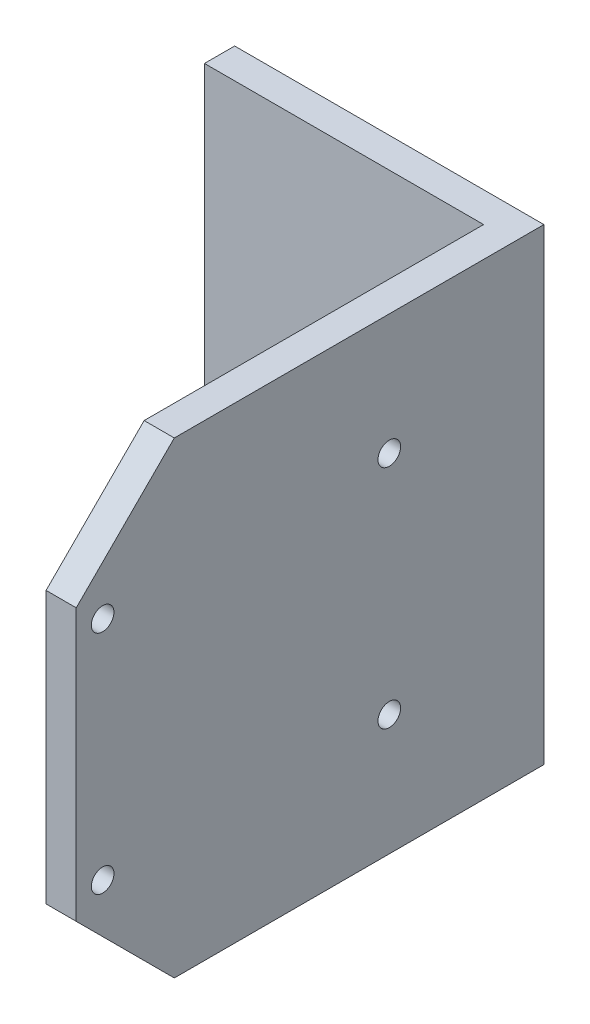
ISO-10303-21;
HEADER;
FILE_DESCRIPTION(('STEP AP214'),'2;1');
FILE_NAME('part.step','',(''),(''),'','','');
FILE_SCHEMA(('AUTOMOTIVE_DESIGN { 1 0 10303 214 1 1 1 1 }'));
ENDSEC;
DATA;
#1=APPLICATION_CONTEXT('core data for automotive mechanical design processes');
#2=APPLICATION_PROTOCOL_DEFINITION('international standard','automotive_design',2000,#1);
#3=PRODUCT_CONTEXT('',#1,'mechanical');
#4=PRODUCT('Part','Part','',(#3));
#5=PRODUCT_RELATED_PRODUCT_CATEGORY('part','',(#4));
#6=PRODUCT_DEFINITION_FORMATION('','',#4);
#7=PRODUCT_DEFINITION_CONTEXT('part definition',#1,'design');
#8=PRODUCT_DEFINITION('design','',#6,#7);
#9=PRODUCT_DEFINITION_SHAPE('','',#8);
#10=(LENGTH_UNIT() NAMED_UNIT(*) SI_UNIT(.MILLI.,.METRE.));
#11=(NAMED_UNIT(*) PLANE_ANGLE_UNIT() SI_UNIT($,.RADIAN.));
#12=(NAMED_UNIT(*) SI_UNIT($,.STERADIAN.) SOLID_ANGLE_UNIT());
#13=UNCERTAINTY_MEASURE_WITH_UNIT(LENGTH_MEASURE(1.E-05),#10,'distance_accuracy_value','');
#14=(GEOMETRIC_REPRESENTATION_CONTEXT(3) GLOBAL_UNCERTAINTY_ASSIGNED_CONTEXT((#13)) GLOBAL_UNIT_ASSIGNED_CONTEXT((#10,
#11,#12)) REPRESENTATION_CONTEXT('',''));
#15=CARTESIAN_POINT('',(0.,0.,0.));
#16=DIRECTION('',(0.,0.,1.));
#17=DIRECTION('',(1.,0.,0.));
#18=AXIS2_PLACEMENT_3D('',#15,#16,#17);
#19=CARTESIAN_POINT('',(6.87397260273973,31.,18.8424657534247));
#20=DIRECTION('',(1.,0.,0.));
#21=DIRECTION('',(0.,0.,-1.));
#22=AXIS2_PLACEMENT_3D('',#19,#20,#21);
#23=PLANE('',#22);
#24=CARTESIAN_POINT('',(6.87397260273973,15.,15.3424657534247));
#25=DIRECTION('',(1.,0.,0.));
#26=DIRECTION('',(0.,0.,-1.));
#27=AXIS2_PLACEMENT_3D('',#24,#25,#26);
#28=CIRCLE('',#27,1.5);
#29=CARTESIAN_POINT('',(6.87397260273973,15.,13.8424657534247));
#30=VERTEX_POINT('',#29);
#31=EDGE_CURVE('E176',#30,#30,#28,.T.);
#32=ORIENTED_EDGE('',*,*,#31,.T.);
#33=EDGE_LOOP('',(#32));
#34=FACE_BOUND('',#33,.T.);
#35=CARTESIAN_POINT('',(6.87397260273973,-15.,-22.6575342465753));
#36=DIRECTION('',(1.,0.,0.));
#37=DIRECTION('',(0.,0.,-1.));
#38=AXIS2_PLACEMENT_3D('',#35,#36,#37);
#39=CIRCLE('',#38,1.5);
#40=CARTESIAN_POINT('',(6.87397260273973,-15.,-24.1575342465753));
#41=VERTEX_POINT('',#40);
#42=EDGE_CURVE('E189',#41,#41,#39,.T.);
#43=ORIENTED_EDGE('',*,*,#42,.T.);
#44=EDGE_LOOP('',(#43));
#45=FACE_BOUND('',#44,.T.);
#46=DIRECTION('',(0.,-1.,0.));
#47=VECTOR('',#46,1.);
#48=CARTESIAN_POINT('',(6.87397260273973,31.,18.8424657534247));
#49=LINE('',#48,#47);
#50=CARTESIAN_POINT('',(6.87397260273973,18.,18.8424657534247));
#51=VERTEX_POINT('',#50);
#52=CARTESIAN_POINT('',(6.87397260273973,-18.,18.8424657534247));
#53=VERTEX_POINT('',#52);
#54=EDGE_CURVE('E124',#51,#53,#49,.T.);
#55=ORIENTED_EDGE('',*,*,#54,.F.);
#56=DIRECTION('',(0.,0.707106781186548,-0.707106781186548));
#57=VECTOR('',#56,1.);
#58=CARTESIAN_POINT('',(6.87397260273973,24.5,12.3424657534247));
#59=LINE('',#58,#57);
#60=CARTESIAN_POINT('',(6.87397260273973,31.,5.84246575342466));
#61=VERTEX_POINT('',#60);
#62=EDGE_CURVE('E104',#51,#61,#59,.T.);
#63=ORIENTED_EDGE('',*,*,#62,.T.);
#64=DIRECTION('',(0.,0.,1.));
#65=VECTOR('',#64,1.);
#66=CARTESIAN_POINT('',(6.87397260273973,31.,18.8424657534247));
#67=LINE('',#66,#65);
#68=CARTESIAN_POINT('',(6.87397260273973,31.,-39.1575342465753));
#69=VERTEX_POINT('',#68);
#70=EDGE_CURVE('E170',#69,#61,#67,.T.);
#71=ORIENTED_EDGE('',*,*,#70,.F.);
#72=DIRECTION('',(0.,-1.,0.));
#73=VECTOR('',#72,1.);
#74=CARTESIAN_POINT('',(6.87397260273973,31.,-39.1575342465753));
#75=LINE('',#74,#73);
#76=CARTESIAN_POINT('',(6.87397260273973,-31.,-39.1575342465753));
#77=VERTEX_POINT('',#76);
#78=EDGE_CURVE('E127',#69,#77,#75,.T.);
#79=ORIENTED_EDGE('',*,*,#78,.T.);
#80=DIRECTION('',(0.,0.,1.));
#81=VECTOR('',#80,1.);
#82=CARTESIAN_POINT('',(6.87397260273973,-31.,18.8424657534247));
#83=LINE('',#82,#81);
#84=CARTESIAN_POINT('',(6.87397260273973,-31.,5.84246575342466));
#85=VERTEX_POINT('',#84);
#86=EDGE_CURVE('E143',#77,#85,#83,.T.);
#87=ORIENTED_EDGE('',*,*,#86,.T.);
#88=DIRECTION('',(0.,-0.707106781186548,-0.707106781186548));
#89=VECTOR('',#88,1.);
#90=CARTESIAN_POINT('',(6.87397260273973,6.5,43.3424657534247));
#91=LINE('',#90,#89);
#92=EDGE_CURVE('E61',#53,#85,#91,.T.);
#93=ORIENTED_EDGE('',*,*,#92,.F.);
#94=EDGE_LOOP('',(#55,#63,#71,#79,#87,#93));
#95=FACE_BOUND('',#94,.T.);
#96=CARTESIAN_POINT('',(6.87397260273973,15.,-22.6575342465753));
#97=DIRECTION('',(1.,0.,0.));
#98=DIRECTION('',(0.,0.,-1.));
#99=AXIS2_PLACEMENT_3D('',#96,#97,#98);
#100=CIRCLE('',#99,1.5);
#101=CARTESIAN_POINT('',(6.87397260273973,15.,-24.1575342465753));
#102=VERTEX_POINT('',#101);
#103=EDGE_CURVE('E181',#102,#102,#100,.F.);
#104=ORIENTED_EDGE('',*,*,#103,.F.);
#105=EDGE_LOOP('',(#104));
#106=FACE_BOUND('',#105,.T.);
#107=CARTESIAN_POINT('',(6.87397260273973,-15.,15.3424657534247));
#108=DIRECTION('',(1.,0.,0.));
#109=DIRECTION('',(0.,0.,-1.));
#110=AXIS2_PLACEMENT_3D('',#107,#108,#109);
#111=CIRCLE('',#110,1.5);
#112=CARTESIAN_POINT('',(6.87397260273973,-15.,13.8424657534247));
#113=VERTEX_POINT('',#112);
#114=EDGE_CURVE('E173',#113,#113,#111,.F.);
#115=ORIENTED_EDGE('',*,*,#114,.F.);
#116=EDGE_LOOP('',(#115));
#117=FACE_BOUND('',#116,.T.);
#118=ADVANCED_FACE('F39',(#34,#45,#95,#106,#117),#23,.F.);
#119=CARTESIAN_POINT('',(10.8739726027397,31.,18.8424657534247));
#120=DIRECTION('',(0.,0.,-1.));
#121=DIRECTION('',(-1.,0.,0.));
#122=AXIS2_PLACEMENT_3D('',#119,#120,#121);
#123=PLANE('',#122);
#124=DIRECTION('',(0.,-1.,0.));
#125=VECTOR('',#124,1.);
#126=CARTESIAN_POINT('',(10.8739726027397,31.,18.8424657534247));
#127=LINE('',#126,#125);
#128=CARTESIAN_POINT('',(10.8739726027397,18.,18.8424657534247));
#129=VERTEX_POINT('',#128);
#130=CARTESIAN_POINT('',(10.8739726027397,-18.,18.8424657534247));
#131=VERTEX_POINT('',#130);
#132=EDGE_CURVE('E116',#129,#131,#127,.T.);
#133=ORIENTED_EDGE('',*,*,#132,.F.);
#134=DIRECTION('',(1.,0.,0.));
#135=VECTOR('',#134,1.);
#136=CARTESIAN_POINT('',(0.873972602739729,18.,18.8424657534247));
#137=LINE('',#136,#135);
#138=EDGE_CURVE('E101',#51,#129,#137,.T.);
#139=ORIENTED_EDGE('',*,*,#138,.F.);
#140=ORIENTED_EDGE('',*,*,#54,.T.);
#141=DIRECTION('',(1.,0.,0.));
#142=VECTOR('',#141,1.);
#143=CARTESIAN_POINT('',(0.873972602739729,-18.,18.8424657534247));
#144=LINE('',#143,#142);
#145=EDGE_CURVE('E123',#53,#131,#144,.T.);
#146=ORIENTED_EDGE('',*,*,#145,.T.);
#147=EDGE_LOOP('',(#133,#139,#140,#146));
#148=FACE_BOUND('',#147,.T.);
#149=ADVANCED_FACE('F122',(#148),#123,.F.);
#150=CARTESIAN_POINT('',(10.8739726027397,31.,-43.1575342465753));
#151=DIRECTION('',(-1.,0.,0.));
#152=DIRECTION('',(0.,0.,1.));
#153=AXIS2_PLACEMENT_3D('',#150,#151,#152);
#154=PLANE('',#153);
#155=CARTESIAN_POINT('',(10.8739726027397,15.,15.3424657534247));
#156=DIRECTION('',(1.,0.,0.));
#157=DIRECTION('',(0.,0.,-1.));
#158=AXIS2_PLACEMENT_3D('',#155,#156,#157);
#159=CIRCLE('',#158,1.5);
#160=CARTESIAN_POINT('',(10.8739726027397,15.,13.8424657534247));
#161=VERTEX_POINT('',#160);
#162=EDGE_CURVE('E228',#161,#161,#159,.T.);
#163=ORIENTED_EDGE('',*,*,#162,.F.);
#164=EDGE_LOOP('',(#163));
#165=FACE_BOUND('',#164,.T.);
#166=CARTESIAN_POINT('',(10.8739726027397,-15.,-22.6575342465753));
#167=DIRECTION('',(1.,0.,0.));
#168=DIRECTION('',(0.,0.,-1.));
#169=AXIS2_PLACEMENT_3D('',#166,#167,#168);
#170=CIRCLE('',#169,1.5);
#171=CARTESIAN_POINT('',(10.8739726027397,-15.,-24.1575342465753));
#172=VERTEX_POINT('',#171);
#173=EDGE_CURVE('E220',#172,#172,#170,.T.);
#174=ORIENTED_EDGE('',*,*,#173,.F.);
#175=EDGE_LOOP('',(#174));
#176=FACE_BOUND('',#175,.T.);
#177=DIRECTION('',(0.,0.,-1.));
#178=VECTOR('',#177,1.);
#179=CARTESIAN_POINT('',(10.8739726027397,31.,-43.1575342465753));
#180=LINE('',#179,#178);
#181=CARTESIAN_POINT('',(10.8739726027397,31.,5.84246575342466));
#182=VERTEX_POINT('',#181);
#183=CARTESIAN_POINT('',(10.8739726027397,31.,-43.1575342465753));
#184=VERTEX_POINT('',#183);
#185=EDGE_CURVE('E118',#182,#184,#180,.T.);
#186=ORIENTED_EDGE('',*,*,#185,.F.);
#187=DIRECTION('',(0.,0.707106781186548,-0.707106781186548));
#188=VECTOR('',#187,1.);
#189=CARTESIAN_POINT('',(10.8739726027397,18.4212328767123,18.4212328767123));
#190=LINE('',#189,#188);
#191=EDGE_CURVE('E54',#129,#182,#190,.T.);
#192=ORIENTED_EDGE('',*,*,#191,.F.);
#193=ORIENTED_EDGE('',*,*,#132,.T.);
#194=DIRECTION('',(0.,-0.707106781186548,-0.707106781186548));
#195=VECTOR('',#194,1.);
#196=CARTESIAN_POINT('',(10.8739726027397,-18.4212328767123,18.4212328767123));
#197=LINE('',#196,#195);
#198=CARTESIAN_POINT('',(10.8739726027397,-31.,5.84246575342466));
#199=VERTEX_POINT('',#198);
#200=EDGE_CURVE('E119',#131,#199,#197,.T.);
#201=ORIENTED_EDGE('',*,*,#200,.T.);
#202=DIRECTION('',(0.,0.,-1.));
#203=VECTOR('',#202,1.);
#204=CARTESIAN_POINT('',(10.8739726027397,-31.,-43.1575342465753));
#205=LINE('',#204,#203);
#206=CARTESIAN_POINT('',(10.8739726027397,-31.,-43.1575342465753));
#207=VERTEX_POINT('',#206);
#208=EDGE_CURVE('E145',#199,#207,#205,.T.);
#209=ORIENTED_EDGE('',*,*,#208,.T.);
#210=DIRECTION('',(0.,-1.,0.));
#211=VECTOR('',#210,1.);
#212=CARTESIAN_POINT('',(10.8739726027397,31.,-43.1575342465753));
#213=LINE('',#212,#211);
#214=EDGE_CURVE('E125',#184,#207,#213,.T.);
#215=ORIENTED_EDGE('',*,*,#214,.F.);
#216=EDGE_LOOP('',(#186,#192,#193,#201,#209,#215));
#217=FACE_BOUND('',#216,.T.);
#218=CARTESIAN_POINT('',(10.8739726027397,15.,-22.6575342465753));
#219=DIRECTION('',(-1.,0.,0.));
#220=DIRECTION('',(0.,0.,1.));
#221=AXIS2_PLACEMENT_3D('',#218,#219,#220);
#222=CIRCLE('',#221,1.5);
#223=CARTESIAN_POINT('',(10.8739726027397,15.,-21.1575342465753));
#224=VERTEX_POINT('',#223);
#225=EDGE_CURVE('E226',#224,#224,#222,.T.);
#226=ORIENTED_EDGE('',*,*,#225,.T.);
#227=EDGE_LOOP('',(#226));
#228=FACE_BOUND('',#227,.T.);
#229=CARTESIAN_POINT('',(10.8739726027397,-15.,15.3424657534247));
#230=DIRECTION('',(-1.,0.,0.));
#231=DIRECTION('',(0.,0.,1.));
#232=AXIS2_PLACEMENT_3D('',#229,#230,#231);
#233=CIRCLE('',#232,1.5);
#234=CARTESIAN_POINT('',(10.8739726027397,-15.,16.8424657534247));
#235=VERTEX_POINT('',#234);
#236=EDGE_CURVE('E230',#235,#235,#233,.T.);
#237=ORIENTED_EDGE('',*,*,#236,.T.);
#238=EDGE_LOOP('',(#237));
#239=FACE_BOUND('',#238,.T.);
#240=ADVANCED_FACE('F113',(#165,#176,#217,#228,#239),#154,.F.);
#241=CARTESIAN_POINT('',(0.,-31.,0.));
#242=DIRECTION('',(0.,-1.,0.));
#243=DIRECTION('',(0.,0.,-1.));
#244=AXIS2_PLACEMENT_3D('',#241,#242,#243);
#245=PLANE('',#244);
#246=ORIENTED_EDGE('',*,*,#208,.F.);
#247=DIRECTION('',(-1.,0.,0.));
#248=VECTOR('',#247,1.);
#249=CARTESIAN_POINT('',(0.,-31.,5.84246575342466));
#250=LINE('',#249,#248);
#251=EDGE_CURVE('E47',#199,#85,#250,.T.);
#252=ORIENTED_EDGE('',*,*,#251,.T.);
#253=ORIENTED_EDGE('',*,*,#86,.F.);
#254=DIRECTION('',(1.,0.,0.));
#255=VECTOR('',#254,1.);
#256=CARTESIAN_POINT('',(6.87397260273973,-31.,-39.1575342465753));
#257=LINE('',#256,#255);
#258=CARTESIAN_POINT('',(-30.1260273972603,-31.,-39.1575342465753));
#259=VERTEX_POINT('',#258);
#260=EDGE_CURVE('E150',#259,#77,#257,.T.);
#261=ORIENTED_EDGE('',*,*,#260,.F.);
#262=DIRECTION('',(0.,0.,1.));
#263=VECTOR('',#262,1.);
#264=CARTESIAN_POINT('',(-30.1260273972603,-31.,-39.1575342465753));
#265=LINE('',#264,#263);
#266=CARTESIAN_POINT('',(-30.1260273972603,-31.,-43.1575342465753));
#267=VERTEX_POINT('',#266);
#268=EDGE_CURVE('E154',#267,#259,#265,.T.);
#269=ORIENTED_EDGE('',*,*,#268,.F.);
#270=DIRECTION('',(-1.,0.,0.));
#271=VECTOR('',#270,1.);
#272=CARTESIAN_POINT('',(-30.1260273972603,-31.,-43.1575342465753));
#273=LINE('',#272,#271);
#274=EDGE_CURVE('E152',#207,#267,#273,.T.);
#275=ORIENTED_EDGE('',*,*,#274,.F.);
#276=EDGE_LOOP('',(#246,#252,#253,#261,#269,#275));
#277=FACE_BOUND('',#276,.T.);
#278=ADVANCED_FACE('F142',(#277),#245,.T.);
#279=CARTESIAN_POINT('',(-30.1260273972603,31.,-39.1575342465753));
#280=DIRECTION('',(1.,0.,0.));
#281=DIRECTION('',(0.,0.,-1.));
#282=AXIS2_PLACEMENT_3D('',#279,#280,#281);
#283=PLANE('',#282);
#284=ORIENTED_EDGE('',*,*,#268,.T.);
#285=DIRECTION('',(0.,-1.,0.));
#286=VECTOR('',#285,1.);
#287=CARTESIAN_POINT('',(-30.1260273972603,31.,-39.1575342465753));
#288=LINE('',#287,#286);
#289=CARTESIAN_POINT('',(-30.1260273972603,31.,-39.1575342465753));
#290=VERTEX_POINT('',#289);
#291=EDGE_CURVE('E136',#290,#259,#288,.T.);
#292=ORIENTED_EDGE('',*,*,#291,.F.);
#293=DIRECTION('',(0.,0.,1.));
#294=VECTOR('',#293,1.);
#295=CARTESIAN_POINT('',(-30.1260273972603,31.,-39.1575342465753));
#296=LINE('',#295,#294);
#297=CARTESIAN_POINT('',(-30.1260273972603,31.,-43.1575342465753));
#298=VERTEX_POINT('',#297);
#299=EDGE_CURVE('E158',#298,#290,#296,.T.);
#300=ORIENTED_EDGE('',*,*,#299,.F.);
#301=DIRECTION('',(0.,-1.,0.));
#302=VECTOR('',#301,1.);
#303=CARTESIAN_POINT('',(-30.1260273972603,31.,-43.1575342465753));
#304=LINE('',#303,#302);
#305=EDGE_CURVE('E130',#298,#267,#304,.T.);
#306=ORIENTED_EDGE('',*,*,#305,.T.);
#307=EDGE_LOOP('',(#284,#292,#300,#306));
#308=FACE_BOUND('',#307,.T.);
#309=ADVANCED_FACE('F41',(#308),#283,.F.);
#310=CARTESIAN_POINT('',(6.87397260273973,31.,-39.1575342465753));
#311=DIRECTION('',(0.,0.,-1.));
#312=DIRECTION('',(-1.,0.,0.));
#313=AXIS2_PLACEMENT_3D('',#310,#311,#312);
#314=PLANE('',#313);
#315=ORIENTED_EDGE('',*,*,#260,.T.);
#316=ORIENTED_EDGE('',*,*,#78,.F.);
#317=DIRECTION('',(1.,0.,0.));
#318=VECTOR('',#317,1.);
#319=CARTESIAN_POINT('',(6.87397260273973,31.,-39.1575342465753));
#320=LINE('',#319,#318);
#321=EDGE_CURVE('E186',#290,#69,#320,.T.);
#322=ORIENTED_EDGE('',*,*,#321,.F.);
#323=ORIENTED_EDGE('',*,*,#291,.T.);
#324=EDGE_LOOP('',(#315,#316,#322,#323));
#325=FACE_BOUND('',#324,.T.);
#326=ADVANCED_FACE('F209',(#325),#314,.F.);
#327=CARTESIAN_POINT('',(-30.1260273972603,31.,-43.1575342465753));
#328=DIRECTION('',(0.,0.,1.));
#329=DIRECTION('',(1.,0.,0.));
#330=AXIS2_PLACEMENT_3D('',#327,#328,#329);
#331=PLANE('',#330);
#332=ORIENTED_EDGE('',*,*,#274,.T.);
#333=ORIENTED_EDGE('',*,*,#305,.F.);
#334=DIRECTION('',(-1.,0.,0.));
#335=VECTOR('',#334,1.);
#336=CARTESIAN_POINT('',(-30.1260273972603,31.,-43.1575342465753));
#337=LINE('',#336,#335);
#338=EDGE_CURVE('E160',#184,#298,#337,.T.);
#339=ORIENTED_EDGE('',*,*,#338,.F.);
#340=ORIENTED_EDGE('',*,*,#214,.T.);
#341=EDGE_LOOP('',(#332,#333,#339,#340));
#342=FACE_BOUND('',#341,.T.);
#343=ADVANCED_FACE('F211',(#342),#331,.F.);
#344=CARTESIAN_POINT('',(0.,31.,0.));
#345=DIRECTION('',(0.,-1.,0.));
#346=DIRECTION('',(0.,0.,-1.));
#347=AXIS2_PLACEMENT_3D('',#344,#345,#346);
#348=PLANE('',#347);
#349=ORIENTED_EDGE('',*,*,#70,.T.);
#350=DIRECTION('',(1.,0.,0.));
#351=VECTOR('',#350,1.);
#352=CARTESIAN_POINT('',(0.,31.,5.84246575342466));
#353=LINE('',#352,#351);
#354=EDGE_CURVE('E11',#61,#182,#353,.T.);
#355=ORIENTED_EDGE('',*,*,#354,.T.);
#356=ORIENTED_EDGE('',*,*,#185,.T.);
#357=ORIENTED_EDGE('',*,*,#338,.T.);
#358=ORIENTED_EDGE('',*,*,#299,.T.);
#359=ORIENTED_EDGE('',*,*,#321,.T.);
#360=EDGE_LOOP('',(#349,#355,#356,#357,#358,#359));
#361=FACE_BOUND('',#360,.T.);
#362=ADVANCED_FACE('F188',(#361),#348,.F.);
#363=CARTESIAN_POINT('',(0.873972602739729,-18.4212328767123,18.4212328767123));
#364=DIRECTION('',(0.,-0.707106781186548,0.707106781186548));
#365=DIRECTION('',(0.,-0.707106781186548,-0.707106781186548));
#366=AXIS2_PLACEMENT_3D('',#363,#364,#365);
#367=PLANE('',#366);
#368=ORIENTED_EDGE('',*,*,#92,.T.);
#369=ORIENTED_EDGE('',*,*,#251,.F.);
#370=ORIENTED_EDGE('',*,*,#200,.F.);
#371=ORIENTED_EDGE('',*,*,#145,.F.);
#372=EDGE_LOOP('',(#368,#369,#370,#371));
#373=FACE_BOUND('',#372,.T.);
#374=ADVANCED_FACE('F247',(#373),#367,.T.);
#375=CARTESIAN_POINT('',(0.873972602739729,18.4212328767123,18.4212328767123));
#376=DIRECTION('',(0.,-0.707106781186548,-0.707106781186548));
#377=DIRECTION('',(0.,0.707106781186548,-0.707106781186548));
#378=AXIS2_PLACEMENT_3D('',#375,#376,#377);
#379=PLANE('',#378);
#380=ORIENTED_EDGE('',*,*,#138,.T.);
#381=ORIENTED_EDGE('',*,*,#191,.T.);
#382=ORIENTED_EDGE('',*,*,#354,.F.);
#383=ORIENTED_EDGE('',*,*,#62,.F.);
#384=EDGE_LOOP('',(#380,#381,#382,#383));
#385=FACE_BOUND('',#384,.T.);
#386=ADVANCED_FACE('F102',(#385),#379,.F.);
#387=CARTESIAN_POINT('',(0.873972602739725,-15.,-22.6575342465753));
#388=DIRECTION('',(1.,0.,0.));
#389=DIRECTION('',(0.,0.,-1.));
#390=AXIS2_PLACEMENT_3D('',#387,#388,#389);
#391=CYLINDRICAL_SURFACE('',#390,1.5);
#392=ORIENTED_EDGE('',*,*,#173,.T.);
#393=EDGE_LOOP('',(#392));
#394=FACE_BOUND('',#393,.T.);
#395=ORIENTED_EDGE('',*,*,#42,.F.);
#396=EDGE_LOOP('',(#395));
#397=FACE_BOUND('',#396,.T.);
#398=ADVANCED_FACE('F250',(#394,#397),#391,.F.);
#399=CARTESIAN_POINT('',(0.873972602739725,15.,-22.6575342465753));
#400=DIRECTION('',(1.,0.,0.));
#401=DIRECTION('',(0.,0.,-1.));
#402=AXIS2_PLACEMENT_3D('',#399,#400,#401);
#403=CYLINDRICAL_SURFACE('',#402,1.5);
#404=ORIENTED_EDGE('',*,*,#225,.F.);
#405=EDGE_LOOP('',(#404));
#406=FACE_BOUND('',#405,.T.);
#407=ORIENTED_EDGE('',*,*,#103,.T.);
#408=EDGE_LOOP('',(#407));
#409=FACE_BOUND('',#408,.T.);
#410=ADVANCED_FACE('F198',(#406,#409),#403,.F.);
#411=CARTESIAN_POINT('',(0.873972602739729,15.,15.3424657534247));
#412=DIRECTION('',(1.,0.,0.));
#413=DIRECTION('',(0.,0.,-1.));
#414=AXIS2_PLACEMENT_3D('',#411,#412,#413);
#415=CYLINDRICAL_SURFACE('',#414,1.5);
#416=ORIENTED_EDGE('',*,*,#162,.T.);
#417=EDGE_LOOP('',(#416));
#418=FACE_BOUND('',#417,.T.);
#419=ORIENTED_EDGE('',*,*,#31,.F.);
#420=EDGE_LOOP('',(#419));
#421=FACE_BOUND('',#420,.T.);
#422=ADVANCED_FACE('F239',(#418,#421),#415,.F.);
#423=CARTESIAN_POINT('',(0.873972602739729,-15.,15.3424657534247));
#424=DIRECTION('',(1.,0.,0.));
#425=DIRECTION('',(0.,0.,-1.));
#426=AXIS2_PLACEMENT_3D('',#423,#424,#425);
#427=CYLINDRICAL_SURFACE('',#426,1.5);
#428=ORIENTED_EDGE('',*,*,#236,.F.);
#429=EDGE_LOOP('',(#428));
#430=FACE_BOUND('',#429,.T.);
#431=ORIENTED_EDGE('',*,*,#114,.T.);
#432=EDGE_LOOP('',(#431));
#433=FACE_BOUND('',#432,.T.);
#434=ADVANCED_FACE('F237',(#430,#433),#427,.F.);
#435=CLOSED_SHELL('',(#118,#149,#240,#278,#309,#326,#343,#362,#374,#386,#398,#410,#422,#434));
#436=MANIFOLD_SOLID_BREP('B2',#435);
#437=ADVANCED_BREP_SHAPE_REPRESENTATION('',(#18,#436),#14);
#438=SHAPE_DEFINITION_REPRESENTATION(#9,#437);
ENDSEC;
END-ISO-10303-21;
